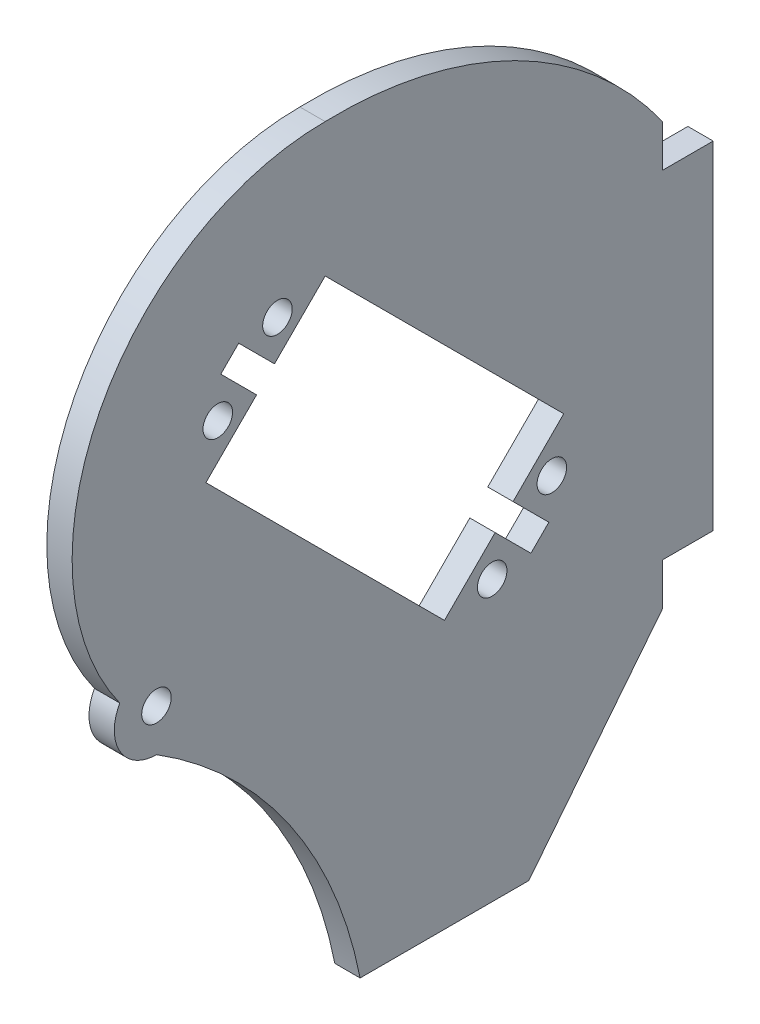
ISO-10303-21;
HEADER;
FILE_DESCRIPTION(('STEP AP214'),'2;1');
FILE_NAME('part.step','',(''),(''),'','','');
FILE_SCHEMA(('AUTOMOTIVE_DESIGN { 1 0 10303 214 1 1 1 1 }'));
ENDSEC;
DATA;
#1=APPLICATION_CONTEXT('core data for automotive mechanical design processes');
#2=APPLICATION_PROTOCOL_DEFINITION('international standard','automotive_design',2000,#1);
#3=PRODUCT_CONTEXT('',#1,'mechanical');
#4=PRODUCT('Part','Part','',(#3));
#5=PRODUCT_RELATED_PRODUCT_CATEGORY('part','',(#4));
#6=PRODUCT_DEFINITION_FORMATION('','',#4);
#7=PRODUCT_DEFINITION_CONTEXT('part definition',#1,'design');
#8=PRODUCT_DEFINITION('design','',#6,#7);
#9=PRODUCT_DEFINITION_SHAPE('','',#8);
#10=(LENGTH_UNIT() NAMED_UNIT(*) SI_UNIT(.MILLI.,.METRE.));
#11=(NAMED_UNIT(*) PLANE_ANGLE_UNIT() SI_UNIT($,.RADIAN.));
#12=(NAMED_UNIT(*) SI_UNIT($,.STERADIAN.) SOLID_ANGLE_UNIT());
#13=UNCERTAINTY_MEASURE_WITH_UNIT(LENGTH_MEASURE(1.E-05),#10,'distance_accuracy_value','');
#14=(GEOMETRIC_REPRESENTATION_CONTEXT(3) GLOBAL_UNCERTAINTY_ASSIGNED_CONTEXT((#13)) GLOBAL_UNIT_ASSIGNED_CONTEXT((#10,
#11,#12)) REPRESENTATION_CONTEXT('',''));
#15=CARTESIAN_POINT('',(0.,0.,0.));
#16=DIRECTION('',(0.,0.,1.));
#17=DIRECTION('',(1.,0.,0.));
#18=AXIS2_PLACEMENT_3D('',#15,#16,#17);
#19=CARTESIAN_POINT('',(3.,-17.4456692338851,-1.27716538305743));
#20=DIRECTION('',(1.,0.,0.));
#21=DIRECTION('',(0.,0.,-1.));
#22=AXIS2_PLACEMENT_3D('',#19,#20,#21);
#23=PLANE('',#22);
#24=CARTESIAN_POINT('',(3.,-26.8718903733424,-19.7971571849698));
#25=DIRECTION('',(1.,0.,0.));
#26=DIRECTION('',(0.,0.,-1.));
#27=AXIS2_PLACEMENT_3D('',#24,#25,#26);
#28=CIRCLE('',#27,1.74999999999991);
#29=CARTESIAN_POINT('',(3.,-26.8718903733424,-21.5471571849697));
#30=VERTEX_POINT('',#29);
#31=EDGE_CURVE('E694',#30,#30,#28,.T.);
#32=ORIENTED_EDGE('',*,*,#31,.F.);
#33=EDGE_LOOP('',(#32));
#34=FACE_BOUND('',#33,.T.);
#35=CARTESIAN_POINT('',(3.,12.7262989582942,5.6584773525561));
#36=DIRECTION('',(1.,0.,0.));
#37=DIRECTION('',(0.,0.,-1.));
#38=AXIS2_PLACEMENT_3D('',#35,#36,#37);
#39=CIRCLE('',#38,1.75);
#40=CARTESIAN_POINT('',(3.,12.7262989582942,3.9084773525561));
#41=VERTEX_POINT('',#40);
#42=EDGE_CURVE('E706',#41,#41,#39,.T.);
#43=ORIENTED_EDGE('',*,*,#42,.F.);
#44=EDGE_LOOP('',(#43));
#45=FACE_BOUND('',#44,.T.);
#46=DIRECTION('',(0.,0.707106781186547,0.707106781186548));
#47=VECTOR('',#46,1.);
#48=CARTESIAN_POINT('',(3.,-14.1421356237309,-28.2842712474618));
#49=LINE('',#48,#47);
#50=CARTESIAN_POINT('',(3.,-14.1421356237309,-28.2842712474618));
#51=VERTEX_POINT('',#50);
#52=CARTESIAN_POINT('',(3.,14.142135623731,0.));
#53=VERTEX_POINT('',#52);
#54=EDGE_CURVE('E195',#51,#53,#49,.T.);
#55=ORIENTED_EDGE('',*,*,#54,.F.);
#56=DIRECTION('',(0.,0.707106781186552,-0.707106781186543));
#57=VECTOR('',#56,1.);
#58=CARTESIAN_POINT('',(3.,-20.1525432638166,-22.2738636073762));
#59=LINE('',#58,#57);
#60=CARTESIAN_POINT('',(3.,-20.1525432638166,-22.2738636073762));
#61=VERTEX_POINT('',#60);
#62=EDGE_CURVE('E187',#61,#51,#59,.T.);
#63=ORIENTED_EDGE('',*,*,#62,.F.);
#64=DIRECTION('',(0.,0.70710678118655,0.707106781186545));
#65=VECTOR('',#64,1.);
#66=CARTESIAN_POINT('',(3.,-24.3951839509359,-26.5165042944955));
#67=LINE('',#66,#65);
#68=CARTESIAN_POINT('',(3.,-24.3951839509359,-26.5165042944955));
#69=VERTEX_POINT('',#68);
#70=EDGE_CURVE('E230',#69,#61,#67,.T.);
#71=ORIENTED_EDGE('',*,*,#70,.F.);
#72=DIRECTION('',(0.,0.707106781186552,-0.707106781186543));
#73=VECTOR('',#72,1.);
#74=CARTESIAN_POINT('',(3.,-26.5183369827491,-24.3933512626823));
#75=LINE('',#74,#73);
#76=CARTESIAN_POINT('',(3.,-26.5183369827491,-24.3933512626823));
#77=VERTEX_POINT('',#76);
#78=EDGE_CURVE('E228',#77,#69,#75,.T.);
#79=ORIENTED_EDGE('',*,*,#78,.F.);
#80=DIRECTION('',(0.,-0.707106781186557,-0.707106781186538));
#81=VECTOR('',#80,1.);
#82=CARTESIAN_POINT('',(3.,-22.2756962956298,-20.150710575563));
#83=LINE('',#82,#81);
#84=CARTESIAN_POINT('',(3.,-22.2756962956298,-20.150710575563));
#85=VERTEX_POINT('',#84);
#86=EDGE_CURVE('E226',#85,#77,#83,.T.);
#87=ORIENTED_EDGE('',*,*,#86,.F.);
#88=DIRECTION('',(0.,0.707106781186548,-0.707106781186547));
#89=VECTOR('',#88,1.);
#90=CARTESIAN_POINT('',(3.,-28.2842712474619,-14.142135623731));
#91=LINE('',#90,#89);
#92=CARTESIAN_POINT('',(3.,-28.2842712474619,-14.142135623731));
#93=VERTEX_POINT('',#92);
#94=EDGE_CURVE('E224',#93,#85,#91,.T.);
#95=ORIENTED_EDGE('',*,*,#94,.F.);
#96=DIRECTION('',(0.,-0.707106781186547,-0.707106781186548));
#97=VECTOR('',#96,1.);
#98=CARTESIAN_POINT('',(3.,0.,14.142135623731));
#99=LINE('',#98,#97);
#100=CARTESIAN_POINT('',(3.,0.,14.142135623731));
#101=VERTEX_POINT('',#100);
#102=EDGE_CURVE('E222',#101,#93,#99,.T.);
#103=ORIENTED_EDGE('',*,*,#102,.F.);
#104=DIRECTION('',(0.,-0.707106781186548,0.707106781186547));
#105=VECTOR('',#104,1.);
#106=CARTESIAN_POINT('',(3.,6.01040764008564,8.1317279836453));
#107=LINE('',#106,#105);
#108=CARTESIAN_POINT('',(3.,6.01040764008564,8.1317279836453));
#109=VERTEX_POINT('',#108);
#110=EDGE_CURVE('E220',#109,#101,#107,.T.);
#111=ORIENTED_EDGE('',*,*,#110,.F.);
#112=DIRECTION('',(0.,-0.707106781186547,-0.707106781186548));
#113=VECTOR('',#112,1.);
#114=CARTESIAN_POINT('',(3.,10.2530483272049,12.3743686707646));
#115=LINE('',#114,#113);
#116=CARTESIAN_POINT('',(3.,10.2530483272049,12.3743686707646));
#117=VERTEX_POINT('',#116);
#118=EDGE_CURVE('E218',#117,#109,#115,.T.);
#119=ORIENTED_EDGE('',*,*,#118,.F.);
#120=DIRECTION('',(0.,-0.707106781186549,0.707106781186546));
#121=VECTOR('',#120,1.);
#122=CARTESIAN_POINT('',(3.,12.3743686707646,10.253048327205));
#123=LINE('',#122,#121);
#124=CARTESIAN_POINT('',(3.,12.3743686707646,10.253048327205));
#125=VERTEX_POINT('',#124);
#126=EDGE_CURVE('E216',#125,#117,#123,.T.);
#127=ORIENTED_EDGE('',*,*,#126,.F.);
#128=DIRECTION('',(0.,0.707106781186547,0.707106781186548));
#129=VECTOR('',#128,1.);
#130=CARTESIAN_POINT('',(3.,8.13172798364529,6.01040764008567));
#131=LINE('',#130,#129);
#132=CARTESIAN_POINT('',(3.,8.13172798364529,6.01040764008567));
#133=VERTEX_POINT('',#132);
#134=EDGE_CURVE('E211',#133,#125,#131,.T.);
#135=ORIENTED_EDGE('',*,*,#134,.F.);
#136=DIRECTION('',(0.,-0.707106781186549,0.707106781186546));
#137=VECTOR('',#136,1.);
#138=CARTESIAN_POINT('',(3.,14.142135623731,0.));
#139=LINE('',#138,#137);
#140=EDGE_CURVE('E209',#53,#133,#139,.T.);
#141=ORIENTED_EDGE('',*,*,#140,.F.);
#142=EDGE_LOOP('',(#55,#63,#71,#79,#87,#95,#103,#111,#119,#127,#135,#141));
#143=FACE_BOUND('',#142,.T.);
#144=CARTESIAN_POINT('',(3.,-17.4456692338851,-1.27716538305743));
#145=DIRECTION('',(1.,0.,0.));
#146=DIRECTION('',(0.,0.,-1.));
#147=AXIS2_PLACEMENT_3D('',#144,#145,#146);
#148=CIRCLE('',#147,47.4628557976331);
#149=CARTESIAN_POINT('',(3.,10.,-40.));
#150=VERTEX_POINT('',#149);
#151=CARTESIAN_POINT('',(3.,30.,0.));
#152=VERTEX_POINT('',#151);
#153=EDGE_CURVE('E283',#150,#152,#148,.T.);
#154=ORIENTED_EDGE('',*,*,#153,.T.);
#155=CARTESIAN_POINT('',(3.,0.,0.));
#156=DIRECTION('',(1.,0.,0.));
#157=DIRECTION('',(0.,0.,-1.));
#158=AXIS2_PLACEMENT_3D('',#155,#156,#157);
#159=CIRCLE('',#158,30.);
#160=CARTESIAN_POINT('',(3.,-17.5285274641763,24.3464725358237));
#161=VERTEX_POINT('',#160);
#162=EDGE_CURVE('E286',#152,#161,#159,.T.);
#163=ORIENTED_EDGE('',*,*,#162,.T.);
#164=CARTESIAN_POINT('',(3.,-20.,20.));
#165=DIRECTION('',(1.,0.,0.));
#166=DIRECTION('',(0.,0.,-1.));
#167=AXIS2_PLACEMENT_3D('',#164,#165,#166);
#168=CIRCLE('',#167,5.);
#169=CARTESIAN_POINT('',(3.,-25.,20.));
#170=VERTEX_POINT('',#169);
#171=EDGE_CURVE('E289',#161,#170,#168,.T.);
#172=ORIENTED_EDGE('',*,*,#171,.T.);
#173=CARTESIAN_POINT('',(3.,-70.2862696524671,48.2120062704618));
#174=DIRECTION('',(-1.,0.,0.));
#175=DIRECTION('',(0.,0.,1.));
#176=AXIS2_PLACEMENT_3D('',#173,#174,#175);
#177=CIRCLE('',#176,53.3550702074371);
#178=CARTESIAN_POINT('',(3.,-60.,-4.14213562373097));
#179=VERTEX_POINT('',#178);
#180=EDGE_CURVE('E291',#170,#179,#177,.T.);
#181=ORIENTED_EDGE('',*,*,#180,.T.);
#182=DIRECTION('',(0.,0.,-1.));
#183=VECTOR('',#182,1.);
#184=CARTESIAN_POINT('',(3.,-60.,-4.14213562373097));
#185=LINE('',#184,#183);
#186=CARTESIAN_POINT('',(3.,-60.,-24.142135623731));
#187=VERTEX_POINT('',#186);
#188=EDGE_CURVE('E293',#179,#187,#185,.T.);
#189=ORIENTED_EDGE('',*,*,#188,.T.);
#190=DIRECTION('',(0.,0.783577873790359,-0.621293582540638));
#191=VECTOR('',#190,1.);
#192=CARTESIAN_POINT('',(3.,-60.,-24.142135623731));
#193=LINE('',#192,#191);
#194=CARTESIAN_POINT('',(3.,-40.,-40.));
#195=VERTEX_POINT('',#194);
#196=EDGE_CURVE('E295',#187,#195,#193,.T.);
#197=ORIENTED_EDGE('',*,*,#196,.T.);
#198=DIRECTION('',(0.,1.,0.));
#199=VECTOR('',#198,1.);
#200=CARTESIAN_POINT('',(3.,-40.,-40.));
#201=LINE('',#200,#199);
#202=CARTESIAN_POINT('',(3.,-35.,-40.));
#203=VERTEX_POINT('',#202);
#204=EDGE_CURVE('E297',#195,#203,#201,.T.);
#205=ORIENTED_EDGE('',*,*,#204,.T.);
#206=DIRECTION('',(0.,0.,-1.));
#207=VECTOR('',#206,1.);
#208=CARTESIAN_POINT('',(3.,-35.,-40.));
#209=LINE('',#208,#207);
#210=CARTESIAN_POINT('',(3.,-35.,-46.));
#211=VERTEX_POINT('',#210);
#212=EDGE_CURVE('E299',#203,#211,#209,.T.);
#213=ORIENTED_EDGE('',*,*,#212,.T.);
#214=DIRECTION('',(0.,1.,0.));
#215=VECTOR('',#214,1.);
#216=CARTESIAN_POINT('',(3.,-35.,-46.));
#217=LINE('',#216,#215);
#218=CARTESIAN_POINT('',(3.,5.00000000000001,-46.));
#219=VERTEX_POINT('',#218);
#220=EDGE_CURVE('E301',#211,#219,#217,.T.);
#221=ORIENTED_EDGE('',*,*,#220,.T.);
#222=DIRECTION('',(0.,0.,1.));
#223=VECTOR('',#222,1.);
#224=CARTESIAN_POINT('',(3.,5.00000000000001,-46.));
#225=LINE('',#224,#223);
#226=CARTESIAN_POINT('',(3.,5.,-40.));
#227=VERTEX_POINT('',#226);
#228=EDGE_CURVE('E303',#219,#227,#225,.T.);
#229=ORIENTED_EDGE('',*,*,#228,.T.);
#230=DIRECTION('',(0.,1.,0.));
#231=VECTOR('',#230,1.);
#232=CARTESIAN_POINT('',(3.,10.,-40.));
#233=LINE('',#232,#231);
#234=EDGE_CURVE('E305',#227,#150,#233,.T.);
#235=ORIENTED_EDGE('',*,*,#234,.T.);
#236=EDGE_LOOP('',(#154,#163,#172,#181,#189,#197,#205,#213,#221,#229,#235));
#237=FACE_BOUND('',#236,.T.);
#238=CARTESIAN_POINT('',(3.,5.65469890889873,12.7300774019515));
#239=DIRECTION('',(1.,0.,0.));
#240=DIRECTION('',(0.,0.,-1.));
#241=AXIS2_PLACEMENT_3D('',#238,#239,#240);
#242=CIRCLE('',#241,1.75);
#243=CARTESIAN_POINT('',(3.,5.65469890889873,10.9800774019515));
#244=VERTEX_POINT('',#243);
#245=EDGE_CURVE('E233',#244,#244,#242,.T.);
#246=ORIENTED_EDGE('',*,*,#245,.F.);
#247=EDGE_LOOP('',(#246));
#248=FACE_BOUND('',#247,.T.);
#249=CARTESIAN_POINT('',(3.,-19.7989898732233,-26.8700576850888));
#250=DIRECTION('',(1.,0.,0.));
#251=DIRECTION('',(0.,0.,-1.));
#252=AXIS2_PLACEMENT_3D('',#249,#250,#251);
#253=CIRCLE('',#252,1.75000000000002);
#254=CARTESIAN_POINT('',(3.,-19.7989898732233,-28.6200576850888));
#255=VERTEX_POINT('',#254);
#256=EDGE_CURVE('E700',#255,#255,#253,.T.);
#257=ORIENTED_EDGE('',*,*,#256,.F.);
#258=EDGE_LOOP('',(#257));
#259=FACE_BOUND('',#258,.T.);
#260=CARTESIAN_POINT('',(3.,-20.,20.));
#261=DIRECTION('',(1.,0.,0.));
#262=DIRECTION('',(0.,0.,-1.));
#263=AXIS2_PLACEMENT_3D('',#260,#261,#262);
#264=CIRCLE('',#263,1.75);
#265=CARTESIAN_POINT('',(3.,-20.,18.25));
#266=VERTEX_POINT('',#265);
#267=EDGE_CURVE('E685',#266,#266,#264,.T.);
#268=ORIENTED_EDGE('',*,*,#267,.F.);
#269=EDGE_LOOP('',(#268));
#270=FACE_BOUND('',#269,.T.);
#271=ADVANCED_FACE('F32',(#34,#45,#143,#237,#248,#259,#270),#23,.T.);
#272=CARTESIAN_POINT('',(0.,-17.4456692338851,-1.27716538305743));
#273=DIRECTION('',(1.,0.,0.));
#274=DIRECTION('',(0.,0.,-1.));
#275=AXIS2_PLACEMENT_3D('',#272,#273,#274);
#276=PLANE('',#275);
#277=CARTESIAN_POINT('',(0.,-26.8718903733424,-19.7971571849698));
#278=DIRECTION('',(1.,0.,0.));
#279=DIRECTION('',(0.,0.,-1.));
#280=AXIS2_PLACEMENT_3D('',#277,#278,#279);
#281=CIRCLE('',#280,1.74999999999991);
#282=CARTESIAN_POINT('',(0.,-26.8718903733424,-21.5471571849697));
#283=VERTEX_POINT('',#282);
#284=EDGE_CURVE('E691',#283,#283,#281,.T.);
#285=ORIENTED_EDGE('',*,*,#284,.T.);
#286=EDGE_LOOP('',(#285));
#287=FACE_BOUND('',#286,.T.);
#288=CARTESIAN_POINT('',(0.,12.7262989582942,5.6584773525561));
#289=DIRECTION('',(1.,0.,0.));
#290=DIRECTION('',(0.,0.,-1.));
#291=AXIS2_PLACEMENT_3D('',#288,#289,#290);
#292=CIRCLE('',#291,1.75);
#293=CARTESIAN_POINT('',(0.,12.7262989582942,3.9084773525561));
#294=VERTEX_POINT('',#293);
#295=EDGE_CURVE('E703',#294,#294,#292,.T.);
#296=ORIENTED_EDGE('',*,*,#295,.T.);
#297=EDGE_LOOP('',(#296));
#298=FACE_BOUND('',#297,.T.);
#299=DIRECTION('',(0.,0.707106781186552,-0.707106781186543));
#300=VECTOR('',#299,1.);
#301=CARTESIAN_POINT('',(0.,-20.1525432638166,-22.2738636073762));
#302=LINE('',#301,#300);
#303=CARTESIAN_POINT('',(0.,-20.1525432638166,-22.2738636073762));
#304=VERTEX_POINT('',#303);
#305=CARTESIAN_POINT('',(0.,-14.1421356237309,-28.2842712474618));
#306=VERTEX_POINT('',#305);
#307=EDGE_CURVE('E55',#304,#306,#302,.T.);
#308=ORIENTED_EDGE('',*,*,#307,.T.);
#309=DIRECTION('',(0.,0.707106781186547,0.707106781186548));
#310=VECTOR('',#309,1.);
#311=CARTESIAN_POINT('',(0.,-14.1421356237309,-28.2842712474618));
#312=LINE('',#311,#310);
#313=CARTESIAN_POINT('',(0.,14.142135623731,0.));
#314=VERTEX_POINT('',#313);
#315=EDGE_CURVE('E202',#306,#314,#312,.T.);
#316=ORIENTED_EDGE('',*,*,#315,.T.);
#317=DIRECTION('',(0.,-0.707106781186549,0.707106781186546));
#318=VECTOR('',#317,1.);
#319=CARTESIAN_POINT('',(0.,14.142135623731,0.));
#320=LINE('',#319,#318);
#321=CARTESIAN_POINT('',(0.,8.13172798364529,6.01040764008567));
#322=VERTEX_POINT('',#321);
#323=EDGE_CURVE('E235',#314,#322,#320,.T.);
#324=ORIENTED_EDGE('',*,*,#323,.T.);
#325=DIRECTION('',(0.,0.707106781186547,0.707106781186548));
#326=VECTOR('',#325,1.);
#327=CARTESIAN_POINT('',(0.,8.13172798364529,6.01040764008567));
#328=LINE('',#327,#326);
#329=CARTESIAN_POINT('',(0.,12.3743686707646,10.253048327205));
#330=VERTEX_POINT('',#329);
#331=EDGE_CURVE('E238',#322,#330,#328,.T.);
#332=ORIENTED_EDGE('',*,*,#331,.T.);
#333=DIRECTION('',(0.,-0.707106781186549,0.707106781186546));
#334=VECTOR('',#333,1.);
#335=CARTESIAN_POINT('',(0.,12.3743686707646,10.253048327205));
#336=LINE('',#335,#334);
#337=CARTESIAN_POINT('',(0.,10.2530483272049,12.3743686707646));
#338=VERTEX_POINT('',#337);
#339=EDGE_CURVE('E241',#330,#338,#336,.T.);
#340=ORIENTED_EDGE('',*,*,#339,.T.);
#341=DIRECTION('',(0.,-0.707106781186547,-0.707106781186548));
#342=VECTOR('',#341,1.);
#343=CARTESIAN_POINT('',(0.,10.2530483272049,12.3743686707646));
#344=LINE('',#343,#342);
#345=CARTESIAN_POINT('',(0.,6.01040764008564,8.1317279836453));
#346=VERTEX_POINT('',#345);
#347=EDGE_CURVE('E244',#338,#346,#344,.T.);
#348=ORIENTED_EDGE('',*,*,#347,.T.);
#349=DIRECTION('',(0.,-0.707106781186548,0.707106781186547));
#350=VECTOR('',#349,1.);
#351=CARTESIAN_POINT('',(0.,6.01040764008564,8.1317279836453));
#352=LINE('',#351,#350);
#353=CARTESIAN_POINT('',(0.,0.,14.142135623731));
#354=VERTEX_POINT('',#353);
#355=EDGE_CURVE('E247',#346,#354,#352,.T.);
#356=ORIENTED_EDGE('',*,*,#355,.T.);
#357=DIRECTION('',(0.,-0.707106781186547,-0.707106781186548));
#358=VECTOR('',#357,1.);
#359=CARTESIAN_POINT('',(0.,0.,14.142135623731));
#360=LINE('',#359,#358);
#361=CARTESIAN_POINT('',(0.,-28.2842712474619,-14.142135623731));
#362=VERTEX_POINT('',#361);
#363=EDGE_CURVE('E250',#354,#362,#360,.T.);
#364=ORIENTED_EDGE('',*,*,#363,.T.);
#365=DIRECTION('',(0.,0.707106781186548,-0.707106781186547));
#366=VECTOR('',#365,1.);
#367=CARTESIAN_POINT('',(0.,-28.2842712474619,-14.142135623731));
#368=LINE('',#367,#366);
#369=CARTESIAN_POINT('',(0.,-22.2756962956298,-20.150710575563));
#370=VERTEX_POINT('',#369);
#371=EDGE_CURVE('E253',#362,#370,#368,.T.);
#372=ORIENTED_EDGE('',*,*,#371,.T.);
#373=DIRECTION('',(0.,-0.707106781186557,-0.707106781186538));
#374=VECTOR('',#373,1.);
#375=CARTESIAN_POINT('',(0.,-22.2756962956298,-20.150710575563));
#376=LINE('',#375,#374);
#377=CARTESIAN_POINT('',(0.,-26.5183369827491,-24.3933512626823));
#378=VERTEX_POINT('',#377);
#379=EDGE_CURVE('E256',#370,#378,#376,.T.);
#380=ORIENTED_EDGE('',*,*,#379,.T.);
#381=DIRECTION('',(0.,0.707106781186552,-0.707106781186543));
#382=VECTOR('',#381,1.);
#383=CARTESIAN_POINT('',(0.,-26.5183369827491,-24.3933512626823));
#384=LINE('',#383,#382);
#385=CARTESIAN_POINT('',(0.,-24.3951839509359,-26.5165042944955));
#386=VERTEX_POINT('',#385);
#387=EDGE_CURVE('E259',#378,#386,#384,.T.);
#388=ORIENTED_EDGE('',*,*,#387,.T.);
#389=DIRECTION('',(0.,0.70710678118655,0.707106781186545));
#390=VECTOR('',#389,1.);
#391=CARTESIAN_POINT('',(0.,-24.3951839509359,-26.5165042944955));
#392=LINE('',#391,#390);
#393=EDGE_CURVE('E196',#386,#304,#392,.T.);
#394=ORIENTED_EDGE('',*,*,#393,.T.);
#395=EDGE_LOOP('',(#308,#316,#324,#332,#340,#348,#356,#364,#372,#380,#388,#394));
#396=FACE_BOUND('',#395,.T.);
#397=CARTESIAN_POINT('',(0.,-17.4456692338851,-1.27716538305743));
#398=DIRECTION('',(1.,0.,0.));
#399=DIRECTION('',(0.,0.,-1.));
#400=AXIS2_PLACEMENT_3D('',#397,#398,#399);
#401=CIRCLE('',#400,47.4628557976331);
#402=CARTESIAN_POINT('',(0.,10.,-40.));
#403=VERTEX_POINT('',#402);
#404=CARTESIAN_POINT('',(0.,30.,0.));
#405=VERTEX_POINT('',#404);
#406=EDGE_CURVE('E203',#403,#405,#401,.T.);
#407=ORIENTED_EDGE('',*,*,#406,.F.);
#408=DIRECTION('',(0.,1.,0.));
#409=VECTOR('',#408,1.);
#410=CARTESIAN_POINT('',(0.,10.,-40.));
#411=LINE('',#410,#409);
#412=CARTESIAN_POINT('',(0.,5.,-40.));
#413=VERTEX_POINT('',#412);
#414=EDGE_CURVE('E287',#413,#403,#411,.T.);
#415=ORIENTED_EDGE('',*,*,#414,.F.);
#416=DIRECTION('',(0.,0.,1.));
#417=VECTOR('',#416,1.);
#418=CARTESIAN_POINT('',(0.,5.00000000000001,-46.));
#419=LINE('',#418,#417);
#420=CARTESIAN_POINT('',(0.,5.00000000000001,-46.));
#421=VERTEX_POINT('',#420);
#422=EDGE_CURVE('E326',#421,#413,#419,.T.);
#423=ORIENTED_EDGE('',*,*,#422,.F.);
#424=DIRECTION('',(0.,1.,0.));
#425=VECTOR('',#424,1.);
#426=CARTESIAN_POINT('',(0.,-35.,-46.));
#427=LINE('',#426,#425);
#428=CARTESIAN_POINT('',(0.,-35.,-46.));
#429=VERTEX_POINT('',#428);
#430=EDGE_CURVE('E324',#429,#421,#427,.T.);
#431=ORIENTED_EDGE('',*,*,#430,.F.);
#432=DIRECTION('',(0.,0.,-1.));
#433=VECTOR('',#432,1.);
#434=CARTESIAN_POINT('',(0.,-35.,-40.));
#435=LINE('',#434,#433);
#436=CARTESIAN_POINT('',(0.,-35.,-40.));
#437=VERTEX_POINT('',#436);
#438=EDGE_CURVE('E322',#437,#429,#435,.T.);
#439=ORIENTED_EDGE('',*,*,#438,.F.);
#440=DIRECTION('',(0.,1.,0.));
#441=VECTOR('',#440,1.);
#442=CARTESIAN_POINT('',(0.,-40.,-40.));
#443=LINE('',#442,#441);
#444=CARTESIAN_POINT('',(0.,-40.,-40.));
#445=VERTEX_POINT('',#444);
#446=EDGE_CURVE('E320',#445,#437,#443,.T.);
#447=ORIENTED_EDGE('',*,*,#446,.F.);
#448=DIRECTION('',(0.,0.783577873790359,-0.621293582540638));
#449=VECTOR('',#448,1.);
#450=CARTESIAN_POINT('',(0.,-60.,-24.142135623731));
#451=LINE('',#450,#449);
#452=CARTESIAN_POINT('',(0.,-60.,-24.142135623731));
#453=VERTEX_POINT('',#452);
#454=EDGE_CURVE('E318',#453,#445,#451,.T.);
#455=ORIENTED_EDGE('',*,*,#454,.F.);
#456=DIRECTION('',(0.,0.,-1.));
#457=VECTOR('',#456,1.);
#458=CARTESIAN_POINT('',(0.,-60.,-4.14213562373097));
#459=LINE('',#458,#457);
#460=CARTESIAN_POINT('',(0.,-60.,-4.14213562373097));
#461=VERTEX_POINT('',#460);
#462=EDGE_CURVE('E316',#461,#453,#459,.T.);
#463=ORIENTED_EDGE('',*,*,#462,.F.);
#464=CARTESIAN_POINT('',(0.,-70.2862696524671,48.2120062704618));
#465=DIRECTION('',(-1.,0.,0.));
#466=DIRECTION('',(0.,0.,1.));
#467=AXIS2_PLACEMENT_3D('',#464,#465,#466);
#468=CIRCLE('',#467,53.3550702074371);
#469=CARTESIAN_POINT('',(0.,-25.,20.));
#470=VERTEX_POINT('',#469);
#471=EDGE_CURVE('E314',#470,#461,#468,.T.);
#472=ORIENTED_EDGE('',*,*,#471,.F.);
#473=CARTESIAN_POINT('',(0.,-20.,20.));
#474=DIRECTION('',(1.,0.,0.));
#475=DIRECTION('',(0.,0.,-1.));
#476=AXIS2_PLACEMENT_3D('',#473,#474,#475);
#477=CIRCLE('',#476,5.);
#478=CARTESIAN_POINT('',(0.,-17.5285274641763,24.3464725358237));
#479=VERTEX_POINT('',#478);
#480=EDGE_CURVE('E312',#479,#470,#477,.T.);
#481=ORIENTED_EDGE('',*,*,#480,.F.);
#482=CARTESIAN_POINT('',(0.,0.,0.));
#483=DIRECTION('',(1.,0.,0.));
#484=DIRECTION('',(0.,0.,-1.));
#485=AXIS2_PLACEMENT_3D('',#482,#483,#484);
#486=CIRCLE('',#485,30.);
#487=EDGE_CURVE('E310',#405,#479,#486,.T.);
#488=ORIENTED_EDGE('',*,*,#487,.F.);
#489=EDGE_LOOP('',(#407,#415,#423,#431,#439,#447,#455,#463,#472,#481,#488));
#490=FACE_BOUND('',#489,.T.);
#491=CARTESIAN_POINT('',(0.,5.65469890889873,12.7300774019515));
#492=DIRECTION('',(1.,0.,0.));
#493=DIRECTION('',(0.,0.,-1.));
#494=AXIS2_PLACEMENT_3D('',#491,#492,#493);
#495=CIRCLE('',#494,1.75);
#496=CARTESIAN_POINT('',(0.,5.65469890889873,10.9800774019515));
#497=VERTEX_POINT('',#496);
#498=EDGE_CURVE('E709',#497,#497,#495,.T.);
#499=ORIENTED_EDGE('',*,*,#498,.T.);
#500=EDGE_LOOP('',(#499));
#501=FACE_BOUND('',#500,.T.);
#502=CARTESIAN_POINT('',(0.,-19.7989898732233,-26.8700576850888));
#503=DIRECTION('',(1.,0.,0.));
#504=DIRECTION('',(0.,0.,-1.));
#505=AXIS2_PLACEMENT_3D('',#502,#503,#504);
#506=CIRCLE('',#505,1.75000000000002);
#507=CARTESIAN_POINT('',(0.,-19.7989898732233,-28.6200576850888));
#508=VERTEX_POINT('',#507);
#509=EDGE_CURVE('E697',#508,#508,#506,.T.);
#510=ORIENTED_EDGE('',*,*,#509,.T.);
#511=EDGE_LOOP('',(#510));
#512=FACE_BOUND('',#511,.T.);
#513=CARTESIAN_POINT('',(0.,-20.,20.));
#514=DIRECTION('',(1.,0.,0.));
#515=DIRECTION('',(0.,0.,-1.));
#516=AXIS2_PLACEMENT_3D('',#513,#514,#515);
#517=CIRCLE('',#516,1.75);
#518=CARTESIAN_POINT('',(0.,-20.,18.25));
#519=VERTEX_POINT('',#518);
#520=EDGE_CURVE('E688',#519,#519,#517,.T.);
#521=ORIENTED_EDGE('',*,*,#520,.T.);
#522=EDGE_LOOP('',(#521));
#523=FACE_BOUND('',#522,.T.);
#524=ADVANCED_FACE('F365',(#287,#298,#396,#490,#501,#512,#523),#276,.F.);
#525=CARTESIAN_POINT('',(3.,-17.4456692338851,-1.27716538305743));
#526=DIRECTION('',(-1.,0.,0.));
#527=DIRECTION('',(0.,0.,1.));
#528=AXIS2_PLACEMENT_3D('',#525,#526,#527);
#529=CYLINDRICAL_SURFACE('',#528,47.4628557976331);
#530=ORIENTED_EDGE('',*,*,#406,.T.);
#531=DIRECTION('',(-1.,0.,0.));
#532=VECTOR('',#531,1.);
#533=CARTESIAN_POINT('',(3.,30.,0.));
#534=LINE('',#533,#532);
#535=EDGE_CURVE('E11',#152,#405,#534,.T.);
#536=ORIENTED_EDGE('',*,*,#535,.F.);
#537=ORIENTED_EDGE('',*,*,#153,.F.);
#538=DIRECTION('',(-1.,0.,0.));
#539=VECTOR('',#538,1.);
#540=CARTESIAN_POINT('',(3.,10.,-40.));
#541=LINE('',#540,#539);
#542=EDGE_CURVE('E307',#150,#403,#541,.T.);
#543=ORIENTED_EDGE('',*,*,#542,.T.);
#544=EDGE_LOOP('',(#530,#536,#537,#543));
#545=FACE_BOUND('',#544,.T.);
#546=ADVANCED_FACE('F34',(#545),#529,.T.);
#547=CARTESIAN_POINT('',(3.,0.,0.));
#548=DIRECTION('',(-1.,0.,0.));
#549=DIRECTION('',(0.,0.,1.));
#550=AXIS2_PLACEMENT_3D('',#547,#548,#549);
#551=CYLINDRICAL_SURFACE('',#550,30.);
#552=ORIENTED_EDGE('',*,*,#487,.T.);
#553=DIRECTION('',(-1.,0.,0.));
#554=VECTOR('',#553,1.);
#555=CARTESIAN_POINT('',(3.,-17.5285274641763,24.3464725358237));
#556=LINE('',#555,#554);
#557=EDGE_CURVE('E40',#161,#479,#556,.T.);
#558=ORIENTED_EDGE('',*,*,#557,.F.);
#559=ORIENTED_EDGE('',*,*,#162,.F.);
#560=ORIENTED_EDGE('',*,*,#535,.T.);
#561=EDGE_LOOP('',(#552,#558,#559,#560));
#562=FACE_BOUND('',#561,.T.);
#563=ADVANCED_FACE('F382',(#562),#551,.T.);
#564=CARTESIAN_POINT('',(3.,-20.,20.));
#565=DIRECTION('',(-1.,0.,0.));
#566=DIRECTION('',(0.,0.,1.));
#567=AXIS2_PLACEMENT_3D('',#564,#565,#566);
#568=CYLINDRICAL_SURFACE('',#567,5.);
#569=ORIENTED_EDGE('',*,*,#480,.T.);
#570=DIRECTION('',(-1.,0.,0.));
#571=VECTOR('',#570,1.);
#572=CARTESIAN_POINT('',(3.,-25.,20.));
#573=LINE('',#572,#571);
#574=EDGE_CURVE('E352',#170,#470,#573,.T.);
#575=ORIENTED_EDGE('',*,*,#574,.F.);
#576=ORIENTED_EDGE('',*,*,#171,.F.);
#577=ORIENTED_EDGE('',*,*,#557,.T.);
#578=EDGE_LOOP('',(#569,#575,#576,#577));
#579=FACE_BOUND('',#578,.T.);
#580=ADVANCED_FACE('F359',(#579),#568,.T.);
#581=CARTESIAN_POINT('',(3.,-70.2862696524671,48.2120062704618));
#582=DIRECTION('',(-1.,0.,0.));
#583=DIRECTION('',(0.,0.,1.));
#584=AXIS2_PLACEMENT_3D('',#581,#582,#583);
#585=CYLINDRICAL_SURFACE('',#584,53.3550702074371);
#586=ORIENTED_EDGE('',*,*,#471,.T.);
#587=DIRECTION('',(-1.,0.,0.));
#588=VECTOR('',#587,1.);
#589=CARTESIAN_POINT('',(3.,-60.,-4.14213562373097));
#590=LINE('',#589,#588);
#591=EDGE_CURVE('E349',#179,#461,#590,.T.);
#592=ORIENTED_EDGE('',*,*,#591,.F.);
#593=ORIENTED_EDGE('',*,*,#180,.F.);
#594=ORIENTED_EDGE('',*,*,#574,.T.);
#595=EDGE_LOOP('',(#586,#592,#593,#594));
#596=FACE_BOUND('',#595,.T.);
#597=ADVANCED_FACE('F371',(#596),#585,.F.);
#598=CARTESIAN_POINT('',(3.,-60.,-4.14213562373097));
#599=DIRECTION('',(0.,1.,0.));
#600=DIRECTION('',(0.,0.,1.));
#601=AXIS2_PLACEMENT_3D('',#598,#599,#600);
#602=PLANE('',#601);
#603=ORIENTED_EDGE('',*,*,#462,.T.);
#604=DIRECTION('',(-1.,0.,0.));
#605=VECTOR('',#604,1.);
#606=CARTESIAN_POINT('',(3.,-60.,-24.142135623731));
#607=LINE('',#606,#605);
#608=EDGE_CURVE('E346',#187,#453,#607,.T.);
#609=ORIENTED_EDGE('',*,*,#608,.F.);
#610=ORIENTED_EDGE('',*,*,#188,.F.);
#611=ORIENTED_EDGE('',*,*,#591,.T.);
#612=EDGE_LOOP('',(#603,#609,#610,#611));
#613=FACE_BOUND('',#612,.T.);
#614=ADVANCED_FACE('F375',(#613),#602,.F.);
#615=CARTESIAN_POINT('',(3.,-60.,-24.142135623731));
#616=DIRECTION('',(0.,0.621293582540638,0.783577873790359));
#617=DIRECTION('',(0.,-0.783577873790359,0.621293582540638));
#618=AXIS2_PLACEMENT_3D('',#615,#616,#617);
#619=PLANE('',#618);
#620=ORIENTED_EDGE('',*,*,#454,.T.);
#621=DIRECTION('',(-1.,0.,0.));
#622=VECTOR('',#621,1.);
#623=CARTESIAN_POINT('',(3.,-40.,-40.));
#624=LINE('',#623,#622);
#625=EDGE_CURVE('E343',#195,#445,#624,.T.);
#626=ORIENTED_EDGE('',*,*,#625,.F.);
#627=ORIENTED_EDGE('',*,*,#196,.F.);
#628=ORIENTED_EDGE('',*,*,#608,.T.);
#629=EDGE_LOOP('',(#620,#626,#627,#628));
#630=FACE_BOUND('',#629,.T.);
#631=ADVANCED_FACE('F410',(#630),#619,.F.);
#632=CARTESIAN_POINT('',(3.,-40.,-40.));
#633=DIRECTION('',(0.,0.,1.));
#634=DIRECTION('',(1.,0.,0.));
#635=AXIS2_PLACEMENT_3D('',#632,#633,#634);
#636=PLANE('',#635);
#637=ORIENTED_EDGE('',*,*,#446,.T.);
#638=DIRECTION('',(-1.,0.,0.));
#639=VECTOR('',#638,1.);
#640=CARTESIAN_POINT('',(3.,-35.,-40.));
#641=LINE('',#640,#639);
#642=EDGE_CURVE('E340',#203,#437,#641,.T.);
#643=ORIENTED_EDGE('',*,*,#642,.F.);
#644=ORIENTED_EDGE('',*,*,#204,.F.);
#645=ORIENTED_EDGE('',*,*,#625,.T.);
#646=EDGE_LOOP('',(#637,#643,#644,#645));
#647=FACE_BOUND('',#646,.T.);
#648=ADVANCED_FACE('F408',(#647),#636,.F.);
#649=CARTESIAN_POINT('',(3.,-35.,-40.));
#650=DIRECTION('',(0.,1.,0.));
#651=DIRECTION('',(0.,0.,1.));
#652=AXIS2_PLACEMENT_3D('',#649,#650,#651);
#653=PLANE('',#652);
#654=ORIENTED_EDGE('',*,*,#438,.T.);
#655=DIRECTION('',(-1.,0.,0.));
#656=VECTOR('',#655,1.);
#657=CARTESIAN_POINT('',(3.,-35.,-46.));
#658=LINE('',#657,#656);
#659=EDGE_CURVE('E337',#211,#429,#658,.T.);
#660=ORIENTED_EDGE('',*,*,#659,.F.);
#661=ORIENTED_EDGE('',*,*,#212,.F.);
#662=ORIENTED_EDGE('',*,*,#642,.T.);
#663=EDGE_LOOP('',(#654,#660,#661,#662));
#664=FACE_BOUND('',#663,.T.);
#665=ADVANCED_FACE('F403',(#664),#653,.F.);
#666=CARTESIAN_POINT('',(3.,-35.,-46.));
#667=DIRECTION('',(0.,0.,1.));
#668=DIRECTION('',(1.,0.,0.));
#669=AXIS2_PLACEMENT_3D('',#666,#667,#668);
#670=PLANE('',#669);
#671=ORIENTED_EDGE('',*,*,#430,.T.);
#672=DIRECTION('',(-1.,0.,0.));
#673=VECTOR('',#672,1.);
#674=CARTESIAN_POINT('',(3.,5.00000000000001,-46.));
#675=LINE('',#674,#673);
#676=EDGE_CURVE('E334',#219,#421,#675,.T.);
#677=ORIENTED_EDGE('',*,*,#676,.F.);
#678=ORIENTED_EDGE('',*,*,#220,.F.);
#679=ORIENTED_EDGE('',*,*,#659,.T.);
#680=EDGE_LOOP('',(#671,#677,#678,#679));
#681=FACE_BOUND('',#680,.T.);
#682=ADVANCED_FACE('F398',(#681),#670,.F.);
#683=CARTESIAN_POINT('',(3.,5.00000000000001,-46.));
#684=DIRECTION('',(0.,-1.,0.));
#685=DIRECTION('',(0.,0.,-1.));
#686=AXIS2_PLACEMENT_3D('',#683,#684,#685);
#687=PLANE('',#686);
#688=ORIENTED_EDGE('',*,*,#422,.T.);
#689=DIRECTION('',(-1.,0.,0.));
#690=VECTOR('',#689,1.);
#691=CARTESIAN_POINT('',(3.,5.,-40.));
#692=LINE('',#691,#690);
#693=EDGE_CURVE('E331',#227,#413,#692,.T.);
#694=ORIENTED_EDGE('',*,*,#693,.F.);
#695=ORIENTED_EDGE('',*,*,#228,.F.);
#696=ORIENTED_EDGE('',*,*,#676,.T.);
#697=EDGE_LOOP('',(#688,#694,#695,#696));
#698=FACE_BOUND('',#697,.T.);
#699=ADVANCED_FACE('F394',(#698),#687,.F.);
#700=CARTESIAN_POINT('',(3.,10.,-40.));
#701=DIRECTION('',(0.,0.,1.));
#702=DIRECTION('',(1.,0.,0.));
#703=AXIS2_PLACEMENT_3D('',#700,#701,#702);
#704=PLANE('',#703);
#705=ORIENTED_EDGE('',*,*,#414,.T.);
#706=ORIENTED_EDGE('',*,*,#542,.F.);
#707=ORIENTED_EDGE('',*,*,#234,.F.);
#708=ORIENTED_EDGE('',*,*,#693,.T.);
#709=EDGE_LOOP('',(#705,#706,#707,#708));
#710=FACE_BOUND('',#709,.T.);
#711=ADVANCED_FACE('F389',(#710),#704,.F.);
#712=CARTESIAN_POINT('',(3.,-20.1525432638166,-22.2738636073762));
#713=DIRECTION('',(0.,0.707106781186543,0.707106781186552));
#714=DIRECTION('',(0.,-0.707106781186552,0.707106781186543));
#715=AXIS2_PLACEMENT_3D('',#712,#713,#714);
#716=PLANE('',#715);
#717=ORIENTED_EDGE('',*,*,#307,.F.);
#718=DIRECTION('',(-1.,0.,0.));
#719=VECTOR('',#718,1.);
#720=CARTESIAN_POINT('',(3.,-20.1525432638166,-22.2738636073762));
#721=LINE('',#720,#719);
#722=EDGE_CURVE('E191',#61,#304,#721,.T.);
#723=ORIENTED_EDGE('',*,*,#722,.F.);
#724=ORIENTED_EDGE('',*,*,#62,.T.);
#725=DIRECTION('',(-1.,0.,0.));
#726=VECTOR('',#725,1.);
#727=CARTESIAN_POINT('',(3.,-14.1421356237309,-28.2842712474618));
#728=LINE('',#727,#726);
#729=EDGE_CURVE('E190',#51,#306,#728,.T.);
#730=ORIENTED_EDGE('',*,*,#729,.T.);
#731=EDGE_LOOP('',(#717,#723,#724,#730));
#732=FACE_BOUND('',#731,.T.);
#733=ADVANCED_FACE('F189',(#732),#716,.T.);
#734=CARTESIAN_POINT('',(3.,-14.1421356237309,-28.2842712474618));
#735=DIRECTION('',(0.,-0.707106781186548,0.707106781186547));
#736=DIRECTION('',(0.,-0.707106781186547,-0.707106781186548));
#737=AXIS2_PLACEMENT_3D('',#734,#735,#736);
#738=PLANE('',#737);
#739=ORIENTED_EDGE('',*,*,#315,.F.);
#740=ORIENTED_EDGE('',*,*,#729,.F.);
#741=ORIENTED_EDGE('',*,*,#54,.T.);
#742=DIRECTION('',(-1.,0.,0.));
#743=VECTOR('',#742,1.);
#744=CARTESIAN_POINT('',(3.,14.142135623731,0.));
#745=LINE('',#744,#743);
#746=EDGE_CURVE('E204',#53,#314,#745,.T.);
#747=ORIENTED_EDGE('',*,*,#746,.T.);
#748=EDGE_LOOP('',(#739,#740,#741,#747));
#749=FACE_BOUND('',#748,.T.);
#750=ADVANCED_FACE('F199',(#749),#738,.T.);
#751=CARTESIAN_POINT('',(3.,14.142135623731,0.));
#752=DIRECTION('',(0.,-0.707106781186546,-0.707106781186549));
#753=DIRECTION('',(0.,0.707106781186549,-0.707106781186546));
#754=AXIS2_PLACEMENT_3D('',#751,#752,#753);
#755=PLANE('',#754);
#756=ORIENTED_EDGE('',*,*,#323,.F.);
#757=ORIENTED_EDGE('',*,*,#746,.F.);
#758=ORIENTED_EDGE('',*,*,#140,.T.);
#759=DIRECTION('',(-1.,0.,0.));
#760=VECTOR('',#759,1.);
#761=CARTESIAN_POINT('',(3.,8.13172798364529,6.01040764008567));
#762=LINE('',#761,#760);
#763=EDGE_CURVE('E280',#133,#322,#762,.T.);
#764=ORIENTED_EDGE('',*,*,#763,.T.);
#765=EDGE_LOOP('',(#756,#757,#758,#764));
#766=FACE_BOUND('',#765,.T.);
#767=ADVANCED_FACE('F466',(#766),#755,.T.);
#768=CARTESIAN_POINT('',(3.,8.13172798364529,6.01040764008567));
#769=DIRECTION('',(0.,-0.707106781186548,0.707106781186547));
#770=DIRECTION('',(0.,-0.707106781186547,-0.707106781186548));
#771=AXIS2_PLACEMENT_3D('',#768,#769,#770);
#772=PLANE('',#771);
#773=ORIENTED_EDGE('',*,*,#331,.F.);
#774=ORIENTED_EDGE('',*,*,#763,.F.);
#775=ORIENTED_EDGE('',*,*,#134,.T.);
#776=DIRECTION('',(-1.,0.,0.));
#777=VECTOR('',#776,1.);
#778=CARTESIAN_POINT('',(3.,12.3743686707646,10.253048327205));
#779=LINE('',#778,#777);
#780=EDGE_CURVE('E278',#125,#330,#779,.T.);
#781=ORIENTED_EDGE('',*,*,#780,.T.);
#782=EDGE_LOOP('',(#773,#774,#775,#781));
#783=FACE_BOUND('',#782,.T.);
#784=ADVANCED_FACE('F472',(#783),#772,.T.);
#785=CARTESIAN_POINT('',(3.,12.3743686707646,10.253048327205));
#786=DIRECTION('',(0.,-0.707106781186546,-0.707106781186549));
#787=DIRECTION('',(0.,0.707106781186549,-0.707106781186546));
#788=AXIS2_PLACEMENT_3D('',#785,#786,#787);
#789=PLANE('',#788);
#790=ORIENTED_EDGE('',*,*,#339,.F.);
#791=ORIENTED_EDGE('',*,*,#780,.F.);
#792=ORIENTED_EDGE('',*,*,#126,.T.);
#793=DIRECTION('',(-1.,0.,0.));
#794=VECTOR('',#793,1.);
#795=CARTESIAN_POINT('',(3.,10.2530483272049,12.3743686707646));
#796=LINE('',#795,#794);
#797=EDGE_CURVE('E276',#117,#338,#796,.T.);
#798=ORIENTED_EDGE('',*,*,#797,.T.);
#799=EDGE_LOOP('',(#790,#791,#792,#798));
#800=FACE_BOUND('',#799,.T.);
#801=ADVANCED_FACE('F480',(#800),#789,.T.);
#802=CARTESIAN_POINT('',(3.,10.2530483272049,12.3743686707646));
#803=DIRECTION('',(0.,0.707106781186548,-0.707106781186547));
#804=DIRECTION('',(0.,0.707106781186547,0.707106781186548));
#805=AXIS2_PLACEMENT_3D('',#802,#803,#804);
#806=PLANE('',#805);
#807=ORIENTED_EDGE('',*,*,#347,.F.);
#808=ORIENTED_EDGE('',*,*,#797,.F.);
#809=ORIENTED_EDGE('',*,*,#118,.T.);
#810=DIRECTION('',(-1.,0.,0.));
#811=VECTOR('',#810,1.);
#812=CARTESIAN_POINT('',(3.,6.01040764008564,8.1317279836453));
#813=LINE('',#812,#811);
#814=EDGE_CURVE('E274',#109,#346,#813,.T.);
#815=ORIENTED_EDGE('',*,*,#814,.T.);
#816=EDGE_LOOP('',(#807,#808,#809,#815));
#817=FACE_BOUND('',#816,.T.);
#818=ADVANCED_FACE('F488',(#817),#806,.T.);
#819=CARTESIAN_POINT('',(3.,6.01040764008564,8.1317279836453));
#820=DIRECTION('',(0.,-0.707106781186547,-0.707106781186548));
#821=DIRECTION('',(0.,0.707106781186548,-0.707106781186547));
#822=AXIS2_PLACEMENT_3D('',#819,#820,#821);
#823=PLANE('',#822);
#824=ORIENTED_EDGE('',*,*,#355,.F.);
#825=ORIENTED_EDGE('',*,*,#814,.F.);
#826=ORIENTED_EDGE('',*,*,#110,.T.);
#827=DIRECTION('',(-1.,0.,0.));
#828=VECTOR('',#827,1.);
#829=CARTESIAN_POINT('',(3.,0.,14.142135623731));
#830=LINE('',#829,#828);
#831=EDGE_CURVE('E272',#101,#354,#830,.T.);
#832=ORIENTED_EDGE('',*,*,#831,.T.);
#833=EDGE_LOOP('',(#824,#825,#826,#832));
#834=FACE_BOUND('',#833,.T.);
#835=ADVANCED_FACE('F496',(#834),#823,.T.);
#836=CARTESIAN_POINT('',(3.,0.,14.142135623731));
#837=DIRECTION('',(0.,0.707106781186548,-0.707106781186547));
#838=DIRECTION('',(0.,0.707106781186547,0.707106781186548));
#839=AXIS2_PLACEMENT_3D('',#836,#837,#838);
#840=PLANE('',#839);
#841=ORIENTED_EDGE('',*,*,#363,.F.);
#842=ORIENTED_EDGE('',*,*,#831,.F.);
#843=ORIENTED_EDGE('',*,*,#102,.T.);
#844=DIRECTION('',(-1.,0.,0.));
#845=VECTOR('',#844,1.);
#846=CARTESIAN_POINT('',(3.,-28.2842712474619,-14.142135623731));
#847=LINE('',#846,#845);
#848=EDGE_CURVE('E270',#93,#362,#847,.T.);
#849=ORIENTED_EDGE('',*,*,#848,.T.);
#850=EDGE_LOOP('',(#841,#842,#843,#849));
#851=FACE_BOUND('',#850,.T.);
#852=ADVANCED_FACE('F504',(#851),#840,.T.);
#853=CARTESIAN_POINT('',(3.,-28.2842712474619,-14.142135623731));
#854=DIRECTION('',(0.,0.707106781186547,0.707106781186548));
#855=DIRECTION('',(0.,-0.707106781186548,0.707106781186547));
#856=AXIS2_PLACEMENT_3D('',#853,#854,#855);
#857=PLANE('',#856);
#858=ORIENTED_EDGE('',*,*,#371,.F.);
#859=ORIENTED_EDGE('',*,*,#848,.F.);
#860=ORIENTED_EDGE('',*,*,#94,.T.);
#861=DIRECTION('',(-1.,0.,0.));
#862=VECTOR('',#861,1.);
#863=CARTESIAN_POINT('',(3.,-22.2756962956298,-20.150710575563));
#864=LINE('',#863,#862);
#865=EDGE_CURVE('E268',#85,#370,#864,.T.);
#866=ORIENTED_EDGE('',*,*,#865,.T.);
#867=EDGE_LOOP('',(#858,#859,#860,#866));
#868=FACE_BOUND('',#867,.T.);
#869=ADVANCED_FACE('F512',(#868),#857,.T.);
#870=CARTESIAN_POINT('',(3.,-22.2756962956298,-20.150710575563));
#871=DIRECTION('',(0.,0.707106781186538,-0.707106781186557));
#872=DIRECTION('',(0.,0.707106781186557,0.707106781186538));
#873=AXIS2_PLACEMENT_3D('',#870,#871,#872);
#874=PLANE('',#873);
#875=ORIENTED_EDGE('',*,*,#379,.F.);
#876=ORIENTED_EDGE('',*,*,#865,.F.);
#877=ORIENTED_EDGE('',*,*,#86,.T.);
#878=DIRECTION('',(-1.,0.,0.));
#879=VECTOR('',#878,1.);
#880=CARTESIAN_POINT('',(3.,-26.5183369827491,-24.3933512626823));
#881=LINE('',#880,#879);
#882=EDGE_CURVE('E266',#77,#378,#881,.T.);
#883=ORIENTED_EDGE('',*,*,#882,.T.);
#884=EDGE_LOOP('',(#875,#876,#877,#883));
#885=FACE_BOUND('',#884,.T.);
#886=ADVANCED_FACE('F520',(#885),#874,.T.);
#887=CARTESIAN_POINT('',(3.,-26.5183369827491,-24.3933512626823));
#888=DIRECTION('',(0.,0.707106781186543,0.707106781186552));
#889=DIRECTION('',(0.,-0.707106781186552,0.707106781186543));
#890=AXIS2_PLACEMENT_3D('',#887,#888,#889);
#891=PLANE('',#890);
#892=ORIENTED_EDGE('',*,*,#387,.F.);
#893=ORIENTED_EDGE('',*,*,#882,.F.);
#894=ORIENTED_EDGE('',*,*,#78,.T.);
#895=DIRECTION('',(-1.,0.,0.));
#896=VECTOR('',#895,1.);
#897=CARTESIAN_POINT('',(3.,-24.3951839509359,-26.5165042944955));
#898=LINE('',#897,#896);
#899=EDGE_CURVE('E47',#69,#386,#898,.T.);
#900=ORIENTED_EDGE('',*,*,#899,.T.);
#901=EDGE_LOOP('',(#892,#893,#894,#900));
#902=FACE_BOUND('',#901,.T.);
#903=ADVANCED_FACE('F528',(#902),#891,.T.);
#904=CARTESIAN_POINT('',(3.,-24.3951839509359,-26.5165042944955));
#905=DIRECTION('',(0.,-0.707106781186545,0.70710678118655));
#906=DIRECTION('',(0.,-0.70710678118655,-0.707106781186545));
#907=AXIS2_PLACEMENT_3D('',#904,#905,#906);
#908=PLANE('',#907);
#909=ORIENTED_EDGE('',*,*,#393,.F.);
#910=ORIENTED_EDGE('',*,*,#899,.F.);
#911=ORIENTED_EDGE('',*,*,#70,.T.);
#912=ORIENTED_EDGE('',*,*,#722,.T.);
#913=EDGE_LOOP('',(#909,#910,#911,#912));
#914=FACE_BOUND('',#913,.T.);
#915=ADVANCED_FACE('F536',(#914),#908,.T.);
#916=CARTESIAN_POINT('',(3.,5.65469890889873,12.7300774019515));
#917=DIRECTION('',(-1.,0.,0.));
#918=DIRECTION('',(0.,0.,1.));
#919=AXIS2_PLACEMENT_3D('',#916,#917,#918);
#920=CYLINDRICAL_SURFACE('',#919,1.75);
#921=ORIENTED_EDGE('',*,*,#245,.T.);
#922=EDGE_LOOP('',(#921));
#923=FACE_BOUND('',#922,.T.);
#924=ORIENTED_EDGE('',*,*,#498,.F.);
#925=EDGE_LOOP('',(#924));
#926=FACE_BOUND('',#925,.T.);
#927=ADVANCED_FACE('F544',(#923,#926),#920,.F.);
#928=CARTESIAN_POINT('',(3.,12.7262989582942,5.6584773525561));
#929=DIRECTION('',(-1.,0.,0.));
#930=DIRECTION('',(0.,0.,1.));
#931=AXIS2_PLACEMENT_3D('',#928,#929,#930);
#932=CYLINDRICAL_SURFACE('',#931,1.75);
#933=ORIENTED_EDGE('',*,*,#42,.T.);
#934=EDGE_LOOP('',(#933));
#935=FACE_BOUND('',#934,.T.);
#936=ORIENTED_EDGE('',*,*,#295,.F.);
#937=EDGE_LOOP('',(#936));
#938=FACE_BOUND('',#937,.T.);
#939=ADVANCED_FACE('F551',(#935,#938),#932,.F.);
#940=CARTESIAN_POINT('',(3.,-19.7989898732233,-26.8700576850888));
#941=DIRECTION('',(-1.,0.,0.));
#942=DIRECTION('',(0.,0.,1.));
#943=AXIS2_PLACEMENT_3D('',#940,#941,#942);
#944=CYLINDRICAL_SURFACE('',#943,1.75000000000002);
#945=ORIENTED_EDGE('',*,*,#256,.T.);
#946=EDGE_LOOP('',(#945));
#947=FACE_BOUND('',#946,.T.);
#948=ORIENTED_EDGE('',*,*,#509,.F.);
#949=EDGE_LOOP('',(#948));
#950=FACE_BOUND('',#949,.T.);
#951=ADVANCED_FACE('F559',(#947,#950),#944,.F.);
#952=CARTESIAN_POINT('',(3.,-26.8718903733424,-19.7971571849698));
#953=DIRECTION('',(-1.,0.,0.));
#954=DIRECTION('',(0.,0.,1.));
#955=AXIS2_PLACEMENT_3D('',#952,#953,#954);
#956=CYLINDRICAL_SURFACE('',#955,1.74999999999991);
#957=ORIENTED_EDGE('',*,*,#31,.T.);
#958=EDGE_LOOP('',(#957));
#959=FACE_BOUND('',#958,.T.);
#960=ORIENTED_EDGE('',*,*,#284,.F.);
#961=EDGE_LOOP('',(#960));
#962=FACE_BOUND('',#961,.T.);
#963=ADVANCED_FACE('F567',(#959,#962),#956,.F.);
#964=CARTESIAN_POINT('',(3.,-20.,20.));
#965=DIRECTION('',(-1.,0.,0.));
#966=DIRECTION('',(0.,0.,1.));
#967=AXIS2_PLACEMENT_3D('',#964,#965,#966);
#968=CYLINDRICAL_SURFACE('',#967,1.75);
#969=ORIENTED_EDGE('',*,*,#267,.T.);
#970=EDGE_LOOP('',(#969));
#971=FACE_BOUND('',#970,.T.);
#972=ORIENTED_EDGE('',*,*,#520,.F.);
#973=EDGE_LOOP('',(#972));
#974=FACE_BOUND('',#973,.T.);
#975=ADVANCED_FACE('F575',(#971,#974),#968,.F.);
#976=CLOSED_SHELL('',(#271,#524,#546,#563,#580,#597,#614,#631,#648,#665,#682,#699,#711,#733,
#750,#767,#784,#801,#818,#835,#852,#869,#886,#903,#915,#927,#939,#951,#963,#975));
#977=MANIFOLD_SOLID_BREP('B2',#976);
#978=ADVANCED_BREP_SHAPE_REPRESENTATION('',(#18,#977),#14);
#979=SHAPE_DEFINITION_REPRESENTATION(#9,#978);
ENDSEC;
END-ISO-10303-21;
